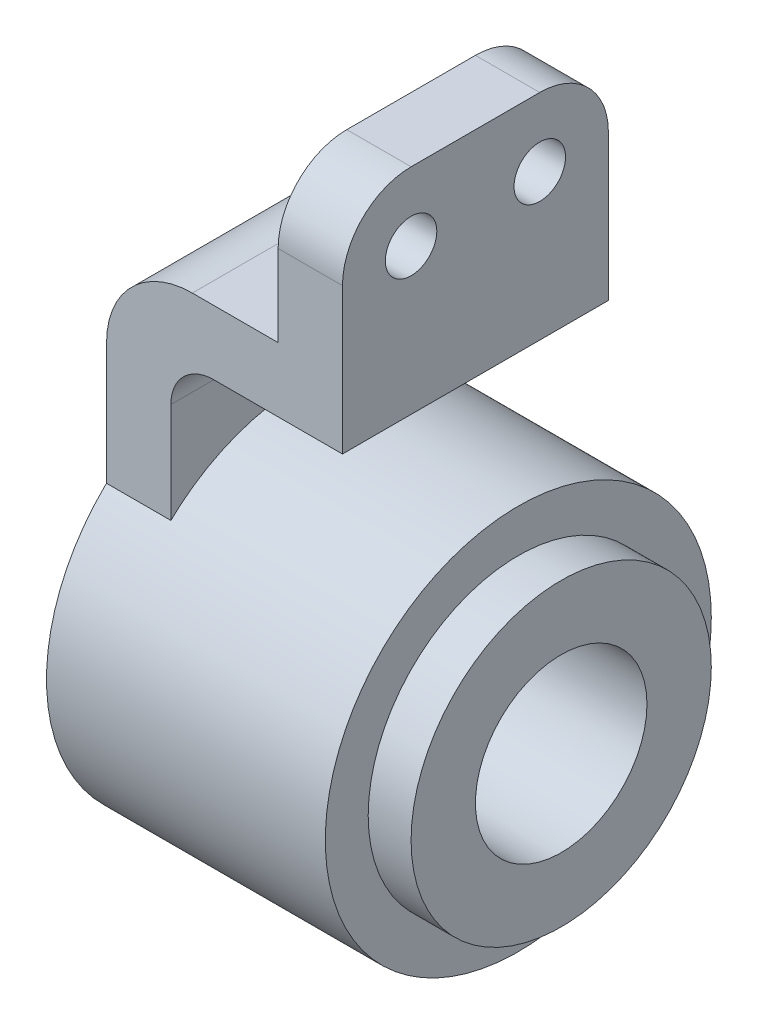
ISO-10303-21;
HEADER;
FILE_DESCRIPTION(('STEP AP214'),'2;1');
FILE_NAME('part.step','',(''),(''),'','','');
FILE_SCHEMA(('AUTOMOTIVE_DESIGN { 1 0 10303 214 1 1 1 1 }'));
ENDSEC;
DATA;
#1=APPLICATION_CONTEXT('core data for automotive mechanical design processes');
#2=APPLICATION_PROTOCOL_DEFINITION('international standard','automotive_design',2000,#1);
#3=PRODUCT_CONTEXT('',#1,'mechanical');
#4=PRODUCT('Part','Part','',(#3));
#5=PRODUCT_RELATED_PRODUCT_CATEGORY('part','',(#4));
#6=PRODUCT_DEFINITION_FORMATION('','',#4);
#7=PRODUCT_DEFINITION_CONTEXT('part definition',#1,'design');
#8=PRODUCT_DEFINITION('design','',#6,#7);
#9=PRODUCT_DEFINITION_SHAPE('','',#8);
#10=(LENGTH_UNIT() NAMED_UNIT(*) SI_UNIT(.MILLI.,.METRE.));
#11=(NAMED_UNIT(*) PLANE_ANGLE_UNIT() SI_UNIT($,.RADIAN.));
#12=(NAMED_UNIT(*) SI_UNIT($,.STERADIAN.) SOLID_ANGLE_UNIT());
#13=UNCERTAINTY_MEASURE_WITH_UNIT(LENGTH_MEASURE(1.E-05),#10,'distance_accuracy_value','');
#14=(GEOMETRIC_REPRESENTATION_CONTEXT(3) GLOBAL_UNCERTAINTY_ASSIGNED_CONTEXT((#13)) GLOBAL_UNIT_ASSIGNED_CONTEXT((#10,
#11,#12)) REPRESENTATION_CONTEXT('',''));
#15=CARTESIAN_POINT('',(0.,0.,0.));
#16=DIRECTION('',(0.,0.,1.));
#17=DIRECTION('',(1.,0.,0.));
#18=AXIS2_PLACEMENT_3D('',#15,#16,#17);
#19=CARTESIAN_POINT('',(15.,0.,31.));
#20=DIRECTION('',(0.,1.,0.));
#21=DIRECTION('',(0.,0.,1.));
#22=AXIS2_PLACEMENT_3D('',#19,#20,#21);
#23=PLANE('',#22);
#24=DIRECTION('',(0.,0.,-1.));
#25=VECTOR('',#24,1.);
#26=CARTESIAN_POINT('',(15.,0.,31.));
#27=LINE('',#26,#25);
#28=CARTESIAN_POINT('',(15.,0.,-20.));
#29=VERTEX_POINT('',#28);
#30=CARTESIAN_POINT('',(15.,0.,-31.));
#31=VERTEX_POINT('',#30);
#32=EDGE_CURVE('E203',#29,#31,#27,.T.);
#33=ORIENTED_EDGE('',*,*,#32,.F.);
#34=DIRECTION('',(-1.,0.,0.));
#35=VECTOR('',#34,1.);
#36=CARTESIAN_POINT('',(0.,0.,-20.));
#37=LINE('',#36,#35);
#38=CARTESIAN_POINT('',(0.,0.,-20.));
#39=VERTEX_POINT('',#38);
#40=EDGE_CURVE('E169',#29,#39,#37,.T.);
#41=ORIENTED_EDGE('',*,*,#40,.T.);
#42=DIRECTION('',(0.,0.,-1.));
#43=VECTOR('',#42,1.);
#44=CARTESIAN_POINT('',(0.,0.,31.));
#45=LINE('',#44,#43);
#46=CARTESIAN_POINT('',(0.,0.,-31.));
#47=VERTEX_POINT('',#46);
#48=EDGE_CURVE('E179',#39,#47,#45,.T.);
#49=ORIENTED_EDGE('',*,*,#48,.T.);
#50=DIRECTION('',(1.,0.,0.));
#51=VECTOR('',#50,1.);
#52=CARTESIAN_POINT('',(15.,0.,-31.));
#53=LINE('',#52,#51);
#54=EDGE_CURVE('E262',#47,#31,#53,.T.);
#55=ORIENTED_EDGE('',*,*,#54,.T.);
#56=EDGE_LOOP('',(#33,#41,#49,#55));
#57=FACE_BOUND('',#56,.T.);
#58=ADVANCED_FACE('F53',(#57),#23,.F.);
#59=CARTESIAN_POINT('',(0.,0.,31.));
#60=VERTEX_POINT('',#59);
#61=CARTESIAN_POINT('',(0.,0.,20.));
#62=VERTEX_POINT('',#61);
#63=EDGE_CURVE('E176',#60,#62,#45,.T.);
#64=ORIENTED_EDGE('',*,*,#63,.T.);
#65=DIRECTION('',(-1.,0.,0.));
#66=VECTOR('',#65,1.);
#67=CARTESIAN_POINT('',(0.,0.,20.));
#68=LINE('',#67,#66);
#69=CARTESIAN_POINT('',(15.,0.,20.));
#70=VERTEX_POINT('',#69);
#71=EDGE_CURVE('E158',#62,#70,#68,.F.);
#72=ORIENTED_EDGE('',*,*,#71,.T.);
#73=CARTESIAN_POINT('',(15.,0.,31.));
#74=VERTEX_POINT('',#73);
#75=EDGE_CURVE('E204',#74,#70,#27,.T.);
#76=ORIENTED_EDGE('',*,*,#75,.F.);
#77=DIRECTION('',(1.,0.,0.));
#78=VECTOR('',#77,1.);
#79=CARTESIAN_POINT('',(15.,0.,31.));
#80=LINE('',#79,#78);
#81=EDGE_CURVE('E184',#60,#74,#80,.T.);
#82=ORIENTED_EDGE('',*,*,#81,.F.);
#83=EDGE_LOOP('',(#64,#72,#76,#82));
#84=FACE_BOUND('',#83,.T.);
#85=ADVANCED_FACE('F182',(#84),#23,.F.);
#86=CARTESIAN_POINT('',(15.,66.,31.));
#87=DIRECTION('',(-1.,0.,0.));
#88=DIRECTION('',(0.,-1.,0.));
#89=AXIS2_PLACEMENT_3D('',#86,#87,#88);
#90=PLANE('',#89);
#91=DIRECTION('',(0.,1.,0.));
#92=VECTOR('',#91,1.);
#93=CARTESIAN_POINT('',(15.,66.,-31.));
#94=LINE('',#93,#92);
#95=CARTESIAN_POINT('',(15.,56.,-31.));
#96=VERTEX_POINT('',#95);
#97=EDGE_CURVE('E259',#31,#96,#94,.T.);
#98=ORIENTED_EDGE('',*,*,#97,.T.);
#99=DIRECTION('',(0.,0.,-1.));
#100=VECTOR('',#99,1.);
#101=CARTESIAN_POINT('',(15.,56.,31.));
#102=LINE('',#101,#100);
#103=CARTESIAN_POINT('',(15.,56.,31.));
#104=VERTEX_POINT('',#103);
#105=EDGE_CURVE('E210',#96,#104,#102,.F.);
#106=ORIENTED_EDGE('',*,*,#105,.T.);
#107=DIRECTION('',(0.,1.,0.));
#108=VECTOR('',#107,1.);
#109=CARTESIAN_POINT('',(15.,66.,31.));
#110=LINE('',#109,#108);
#111=EDGE_CURVE('E275',#74,#104,#110,.T.);
#112=ORIENTED_EDGE('',*,*,#111,.F.);
#113=ORIENTED_EDGE('',*,*,#75,.T.);
#114=CARTESIAN_POINT('',(15.,0.,0.));
#115=DIRECTION('',(-1.,0.,0.));
#116=DIRECTION('',(0.,-1.,0.));
#117=AXIS2_PLACEMENT_3D('',#114,#115,#116);
#118=CIRCLE('',#117,20.);
#119=EDGE_CURVE('E164',#70,#29,#118,.T.);
#120=ORIENTED_EDGE('',*,*,#119,.T.);
#121=ORIENTED_EDGE('',*,*,#32,.T.);
#122=EDGE_LOOP('',(#98,#106,#112,#113,#120,#121));
#123=FACE_BOUND('',#122,.T.);
#124=ADVANCED_FACE('F309',(#123),#90,.F.);
#125=CARTESIAN_POINT('',(55.,66.,31.));
#126=DIRECTION('',(0.,1.,0.));
#127=DIRECTION('',(0.,0.,1.));
#128=AXIS2_PLACEMENT_3D('',#125,#126,#127);
#129=PLANE('',#128);
#130=DIRECTION('',(1.,0.,0.));
#131=VECTOR('',#130,1.);
#132=CARTESIAN_POINT('',(55.,66.,31.));
#133=LINE('',#132,#131);
#134=CARTESIAN_POINT('',(25.,66.,31.));
#135=VERTEX_POINT('',#134);
#136=CARTESIAN_POINT('',(55.,66.,31.));
#137=VERTEX_POINT('',#136);
#138=EDGE_CURVE('E273',#135,#137,#133,.T.);
#139=ORIENTED_EDGE('',*,*,#138,.F.);
#140=DIRECTION('',(0.,0.,-1.));
#141=VECTOR('',#140,1.);
#142=CARTESIAN_POINT('',(25.,66.,-31.));
#143=LINE('',#142,#141);
#144=CARTESIAN_POINT('',(25.,66.,-31.));
#145=VERTEX_POINT('',#144);
#146=EDGE_CURVE('E207',#135,#145,#143,.T.);
#147=ORIENTED_EDGE('',*,*,#146,.T.);
#148=DIRECTION('',(1.,0.,0.));
#149=VECTOR('',#148,1.);
#150=CARTESIAN_POINT('',(55.,66.,-31.));
#151=LINE('',#150,#149);
#152=CARTESIAN_POINT('',(55.,66.,-31.));
#153=VERTEX_POINT('',#152);
#154=EDGE_CURVE('E255',#145,#153,#151,.T.);
#155=ORIENTED_EDGE('',*,*,#154,.T.);
#156=DIRECTION('',(0.,0.,-1.));
#157=VECTOR('',#156,1.);
#158=CARTESIAN_POINT('',(55.,66.,31.));
#159=LINE('',#158,#157);
#160=EDGE_CURVE('E200',#137,#153,#159,.T.);
#161=ORIENTED_EDGE('',*,*,#160,.F.);
#162=EDGE_LOOP('',(#139,#147,#155,#161));
#163=FACE_BOUND('',#162,.T.);
#164=ADVANCED_FACE('F350',(#163),#129,.F.);
#165=CARTESIAN_POINT('',(55.,116.,31.));
#166=DIRECTION('',(-1.,0.,0.));
#167=DIRECTION('',(0.,-1.,0.));
#168=AXIS2_PLACEMENT_3D('',#165,#166,#167);
#169=PLANE('',#168);
#170=CARTESIAN_POINT('',(55.,100.,-15.));
#171=DIRECTION('',(1.,0.,0.));
#172=DIRECTION('',(0.,0.,-1.));
#173=AXIS2_PLACEMENT_3D('',#170,#171,#172);
#174=CIRCLE('',#173,6.00000000000001);
#175=CARTESIAN_POINT('',(55.,100.,-21.));
#176=VERTEX_POINT('',#175);
#177=EDGE_CURVE('E285',#176,#176,#174,.T.);
#178=ORIENTED_EDGE('',*,*,#177,.F.);
#179=EDGE_LOOP('',(#178));
#180=FACE_BOUND('',#179,.T.);
#181=CARTESIAN_POINT('',(55.,100.,15.));
#182=DIRECTION('',(1.,0.,0.));
#183=DIRECTION('',(0.,0.,-1.));
#184=AXIS2_PLACEMENT_3D('',#181,#182,#183);
#185=CIRCLE('',#184,6.00000000000001);
#186=CARTESIAN_POINT('',(55.,100.,8.99999999999999));
#187=VERTEX_POINT('',#186);
#188=EDGE_CURVE('E282',#187,#187,#185,.T.);
#189=ORIENTED_EDGE('',*,*,#188,.F.);
#190=EDGE_LOOP('',(#189));
#191=FACE_BOUND('',#190,.T.);
#192=DIRECTION('',(0.,1.,0.));
#193=VECTOR('',#192,1.);
#194=CARTESIAN_POINT('',(55.,116.,-31.));
#195=LINE('',#194,#193);
#196=CARTESIAN_POINT('',(55.,100.,-31.));
#197=VERTEX_POINT('',#196);
#198=EDGE_CURVE('E238',#153,#197,#195,.T.);
#199=ORIENTED_EDGE('',*,*,#198,.T.);
#200=CARTESIAN_POINT('',(55.,100.,-15.));
#201=DIRECTION('',(-1.,0.,0.));
#202=DIRECTION('',(0.,-1.,0.));
#203=AXIS2_PLACEMENT_3D('',#200,#201,#202);
#204=CIRCLE('',#203,16.);
#205=CARTESIAN_POINT('',(55.,116.,-15.));
#206=VERTEX_POINT('',#205);
#207=EDGE_CURVE('E62',#197,#206,#204,.F.);
#208=ORIENTED_EDGE('',*,*,#207,.T.);
#209=DIRECTION('',(0.,0.,-1.));
#210=VECTOR('',#209,1.);
#211=CARTESIAN_POINT('',(55.,116.,31.));
#212=LINE('',#211,#210);
#213=CARTESIAN_POINT('',(55.,116.,15.));
#214=VERTEX_POINT('',#213);
#215=EDGE_CURVE('E197',#214,#206,#212,.T.);
#216=ORIENTED_EDGE('',*,*,#215,.F.);
#217=CARTESIAN_POINT('',(55.,100.,15.));
#218=DIRECTION('',(-1.,0.,0.));
#219=DIRECTION('',(0.,-1.,0.));
#220=AXIS2_PLACEMENT_3D('',#217,#218,#219);
#221=CIRCLE('',#220,16.);
#222=CARTESIAN_POINT('',(55.,100.,31.));
#223=VERTEX_POINT('',#222);
#224=EDGE_CURVE('E69',#214,#223,#221,.F.);
#225=ORIENTED_EDGE('',*,*,#224,.T.);
#226=DIRECTION('',(0.,1.,0.));
#227=VECTOR('',#226,1.);
#228=CARTESIAN_POINT('',(55.,116.,31.));
#229=LINE('',#228,#227);
#230=EDGE_CURVE('E271',#137,#223,#229,.T.);
#231=ORIENTED_EDGE('',*,*,#230,.F.);
#232=ORIENTED_EDGE('',*,*,#160,.T.);
#233=EDGE_LOOP('',(#199,#208,#216,#225,#231,#232));
#234=FACE_BOUND('',#233,.T.);
#235=ADVANCED_FACE('F237',(#180,#191,#234),#169,.F.);
#236=CARTESIAN_POINT('',(40.,116.,31.));
#237=DIRECTION('',(0.,-1.,0.));
#238=DIRECTION('',(0.,0.,-1.));
#239=AXIS2_PLACEMENT_3D('',#236,#237,#238);
#240=PLANE('',#239);
#241=ORIENTED_EDGE('',*,*,#215,.T.);
#242=DIRECTION('',(-1.,0.,0.));
#243=VECTOR('',#242,1.);
#244=CARTESIAN_POINT('',(40.,116.,-15.));
#245=LINE('',#244,#243);
#246=CARTESIAN_POINT('',(40.,116.,-15.));
#247=VERTEX_POINT('',#246);
#248=EDGE_CURVE('E227',#206,#247,#245,.T.);
#249=ORIENTED_EDGE('',*,*,#248,.T.);
#250=DIRECTION('',(0.,0.,-1.));
#251=VECTOR('',#250,1.);
#252=CARTESIAN_POINT('',(40.,116.,31.));
#253=LINE('',#252,#251);
#254=CARTESIAN_POINT('',(40.,116.,15.));
#255=VERTEX_POINT('',#254);
#256=EDGE_CURVE('E188',#255,#247,#253,.T.);
#257=ORIENTED_EDGE('',*,*,#256,.F.);
#258=DIRECTION('',(-1.,0.,0.));
#259=VECTOR('',#258,1.);
#260=CARTESIAN_POINT('',(40.,116.,15.));
#261=LINE('',#260,#259);
#262=EDGE_CURVE('E225',#255,#214,#261,.F.);
#263=ORIENTED_EDGE('',*,*,#262,.T.);
#264=EDGE_LOOP('',(#241,#249,#257,#263));
#265=FACE_BOUND('',#264,.T.);
#266=ADVANCED_FACE('F242',(#265),#240,.F.);
#267=CARTESIAN_POINT('',(40.,81.,31.));
#268=DIRECTION('',(1.,0.,0.));
#269=DIRECTION('',(0.,0.,-1.));
#270=AXIS2_PLACEMENT_3D('',#267,#268,#269);
#271=PLANE('',#270);
#272=CARTESIAN_POINT('',(40.,100.,-15.));
#273=DIRECTION('',(1.,0.,0.));
#274=DIRECTION('',(0.,0.,-1.));
#275=AXIS2_PLACEMENT_3D('',#272,#273,#274);
#276=CIRCLE('',#275,6.00000000000001);
#277=CARTESIAN_POINT('',(40.,100.,-21.));
#278=VERTEX_POINT('',#277);
#279=EDGE_CURVE('E57',#278,#278,#276,.T.);
#280=ORIENTED_EDGE('',*,*,#279,.T.);
#281=EDGE_LOOP('',(#280));
#282=FACE_BOUND('',#281,.T.);
#283=CARTESIAN_POINT('',(40.,100.,15.));
#284=DIRECTION('',(1.,0.,0.));
#285=DIRECTION('',(0.,0.,-1.));
#286=AXIS2_PLACEMENT_3D('',#283,#284,#285);
#287=CIRCLE('',#286,6.00000000000001);
#288=CARTESIAN_POINT('',(40.,100.,8.99999999999999));
#289=VERTEX_POINT('',#288);
#290=EDGE_CURVE('E180',#289,#289,#287,.T.);
#291=ORIENTED_EDGE('',*,*,#290,.T.);
#292=EDGE_LOOP('',(#291));
#293=FACE_BOUND('',#292,.T.);
#294=ORIENTED_EDGE('',*,*,#256,.T.);
#295=CARTESIAN_POINT('',(40.,100.,-15.));
#296=DIRECTION('',(1.,0.,0.));
#297=DIRECTION('',(0.,0.,-1.));
#298=AXIS2_PLACEMENT_3D('',#295,#296,#297);
#299=CIRCLE('',#298,16.);
#300=CARTESIAN_POINT('',(40.,100.,-31.));
#301=VERTEX_POINT('',#300);
#302=EDGE_CURVE('E232',#247,#301,#299,.F.);
#303=ORIENTED_EDGE('',*,*,#302,.T.);
#304=DIRECTION('',(0.,-1.,0.));
#305=VECTOR('',#304,1.);
#306=CARTESIAN_POINT('',(40.,81.,-31.));
#307=LINE('',#306,#305);
#308=CARTESIAN_POINT('',(40.,81.,-31.));
#309=VERTEX_POINT('',#308);
#310=EDGE_CURVE('E249',#301,#309,#307,.T.);
#311=ORIENTED_EDGE('',*,*,#310,.T.);
#312=DIRECTION('',(0.,0.,-1.));
#313=VECTOR('',#312,1.);
#314=CARTESIAN_POINT('',(40.,81.,31.));
#315=LINE('',#314,#313);
#316=CARTESIAN_POINT('',(40.,81.,31.));
#317=VERTEX_POINT('',#316);
#318=EDGE_CURVE('E185',#317,#309,#315,.T.);
#319=ORIENTED_EDGE('',*,*,#318,.F.);
#320=DIRECTION('',(0.,-1.,0.));
#321=VECTOR('',#320,1.);
#322=CARTESIAN_POINT('',(40.,81.,31.));
#323=LINE('',#322,#321);
#324=CARTESIAN_POINT('',(40.,100.,31.));
#325=VERTEX_POINT('',#324);
#326=EDGE_CURVE('E269',#325,#317,#323,.T.);
#327=ORIENTED_EDGE('',*,*,#326,.F.);
#328=CARTESIAN_POINT('',(40.,100.,15.));
#329=DIRECTION('',(1.,0.,0.));
#330=DIRECTION('',(0.,0.,-1.));
#331=AXIS2_PLACEMENT_3D('',#328,#329,#330);
#332=CIRCLE('',#331,16.);
#333=EDGE_CURVE('E230',#325,#255,#332,.F.);
#334=ORIENTED_EDGE('',*,*,#333,.T.);
#335=EDGE_LOOP('',(#294,#303,#311,#319,#327,#334));
#336=FACE_BOUND('',#335,.T.);
#337=ADVANCED_FACE('F247',(#282,#293,#336),#271,.F.);
#338=CARTESIAN_POINT('',(0.,81.,31.));
#339=DIRECTION('',(0.,-1.,0.));
#340=DIRECTION('',(0.,0.,-1.));
#341=AXIS2_PLACEMENT_3D('',#338,#339,#340);
#342=PLANE('',#341);
#343=DIRECTION('',(-1.,0.,0.));
#344=VECTOR('',#343,1.);
#345=CARTESIAN_POINT('',(0.,81.,-31.));
#346=LINE('',#345,#344);
#347=CARTESIAN_POINT('',(20.,81.,-31.));
#348=VERTEX_POINT('',#347);
#349=EDGE_CURVE('E253',#309,#348,#346,.T.);
#350=ORIENTED_EDGE('',*,*,#349,.T.);
#351=DIRECTION('',(0.,0.,-1.));
#352=VECTOR('',#351,1.);
#353=CARTESIAN_POINT('',(20.,81.,31.));
#354=LINE('',#353,#352);
#355=CARTESIAN_POINT('',(20.,81.,31.));
#356=VERTEX_POINT('',#355);
#357=EDGE_CURVE('E221',#348,#356,#354,.F.);
#358=ORIENTED_EDGE('',*,*,#357,.T.);
#359=DIRECTION('',(-1.,0.,0.));
#360=VECTOR('',#359,1.);
#361=CARTESIAN_POINT('',(0.,81.,31.));
#362=LINE('',#361,#360);
#363=EDGE_CURVE('E266',#317,#356,#362,.T.);
#364=ORIENTED_EDGE('',*,*,#363,.F.);
#365=ORIENTED_EDGE('',*,*,#318,.T.);
#366=EDGE_LOOP('',(#350,#358,#364,#365));
#367=FACE_BOUND('',#366,.T.);
#368=ADVANCED_FACE('F336',(#367),#342,.F.);
#369=CARTESIAN_POINT('',(0.,0.,31.));
#370=DIRECTION('',(1.,0.,0.));
#371=DIRECTION('',(0.,0.,-1.));
#372=AXIS2_PLACEMENT_3D('',#369,#370,#371);
#373=PLANE('',#372);
#374=DIRECTION('',(0.,-1.,0.));
#375=VECTOR('',#374,1.);
#376=CARTESIAN_POINT('',(0.,0.,31.));
#377=LINE('',#376,#375);
#378=CARTESIAN_POINT('',(0.,61.,31.));
#379=VERTEX_POINT('',#378);
#380=EDGE_CURVE('E190',#379,#60,#377,.T.);
#381=ORIENTED_EDGE('',*,*,#380,.F.);
#382=DIRECTION('',(0.,0.,-1.));
#383=VECTOR('',#382,1.);
#384=CARTESIAN_POINT('',(0.,61.,31.));
#385=LINE('',#384,#383);
#386=CARTESIAN_POINT('',(0.,61.,-31.));
#387=VERTEX_POINT('',#386);
#388=EDGE_CURVE('E216',#379,#387,#385,.T.);
#389=ORIENTED_EDGE('',*,*,#388,.T.);
#390=DIRECTION('',(0.,-1.,0.));
#391=VECTOR('',#390,1.);
#392=CARTESIAN_POINT('',(0.,0.,-31.));
#393=LINE('',#392,#391);
#394=EDGE_CURVE('E192',#387,#47,#393,.T.);
#395=ORIENTED_EDGE('',*,*,#394,.T.);
#396=ORIENTED_EDGE('',*,*,#48,.F.);
#397=CARTESIAN_POINT('',(0.,0.,0.));
#398=DIRECTION('',(-1.,0.,0.));
#399=DIRECTION('',(0.,0.,1.));
#400=AXIS2_PLACEMENT_3D('',#397,#398,#399);
#401=CIRCLE('',#400,20.);
#402=EDGE_CURVE('E161',#62,#39,#401,.T.);
#403=ORIENTED_EDGE('',*,*,#402,.F.);
#404=ORIENTED_EDGE('',*,*,#63,.F.);
#405=EDGE_LOOP('',(#381,#389,#395,#396,#403,#404));
#406=FACE_BOUND('',#405,.T.);
#407=ADVANCED_FACE('F175',(#406),#373,.F.);
#408=CARTESIAN_POINT('',(0.,0.,31.));
#409=DIRECTION('',(0.,0.,-1.));
#410=DIRECTION('',(-1.,0.,0.));
#411=AXIS2_PLACEMENT_3D('',#408,#409,#410);
#412=PLANE('',#411);
#413=ORIENTED_EDGE('',*,*,#230,.T.);
#414=DIRECTION('',(-1.,0.,0.));
#415=VECTOR('',#414,1.);
#416=CARTESIAN_POINT('',(0.,100.,31.));
#417=LINE('',#416,#415);
#418=EDGE_CURVE('E12',#223,#325,#417,.T.);
#419=ORIENTED_EDGE('',*,*,#418,.T.);
#420=ORIENTED_EDGE('',*,*,#326,.T.);
#421=ORIENTED_EDGE('',*,*,#363,.T.);
#422=CARTESIAN_POINT('',(20.,61.,31.));
#423=DIRECTION('',(0.,0.,-1.));
#424=DIRECTION('',(-1.,0.,0.));
#425=AXIS2_PLACEMENT_3D('',#422,#423,#424);
#426=CIRCLE('',#425,20.);
#427=EDGE_CURVE('E223',#356,#379,#426,.F.);
#428=ORIENTED_EDGE('',*,*,#427,.T.);
#429=ORIENTED_EDGE('',*,*,#380,.T.);
#430=ORIENTED_EDGE('',*,*,#81,.T.);
#431=ORIENTED_EDGE('',*,*,#111,.T.);
#432=CARTESIAN_POINT('',(25.,56.,31.));
#433=DIRECTION('',(0.,0.,-1.));
#434=DIRECTION('',(-1.,0.,0.));
#435=AXIS2_PLACEMENT_3D('',#432,#433,#434);
#436=CIRCLE('',#435,10.);
#437=EDGE_CURVE('E214',#104,#135,#436,.T.);
#438=ORIENTED_EDGE('',*,*,#437,.T.);
#439=ORIENTED_EDGE('',*,*,#138,.T.);
#440=EDGE_LOOP('',(#413,#419,#420,#421,#428,#429,#430,#431,#438,#439));
#441=FACE_BOUND('',#440,.T.);
#442=ADVANCED_FACE('F333',(#441),#412,.F.);
#443=CARTESIAN_POINT('',(0.,0.,-31.));
#444=DIRECTION('',(0.,0.,-1.));
#445=DIRECTION('',(-1.,0.,0.));
#446=AXIS2_PLACEMENT_3D('',#443,#444,#445);
#447=PLANE('',#446);
#448=ORIENTED_EDGE('',*,*,#310,.F.);
#449=DIRECTION('',(-1.,0.,0.));
#450=VECTOR('',#449,1.);
#451=CARTESIAN_POINT('',(55.,100.,-31.));
#452=LINE('',#451,#450);
#453=EDGE_CURVE('E77',#301,#197,#452,.F.);
#454=ORIENTED_EDGE('',*,*,#453,.T.);
#455=ORIENTED_EDGE('',*,*,#198,.F.);
#456=ORIENTED_EDGE('',*,*,#154,.F.);
#457=CARTESIAN_POINT('',(25.,56.,-31.));
#458=DIRECTION('',(0.,0.,-1.));
#459=DIRECTION('',(-1.,0.,0.));
#460=AXIS2_PLACEMENT_3D('',#457,#458,#459);
#461=CIRCLE('',#460,10.);
#462=EDGE_CURVE('E212',#145,#96,#461,.F.);
#463=ORIENTED_EDGE('',*,*,#462,.T.);
#464=ORIENTED_EDGE('',*,*,#97,.F.);
#465=ORIENTED_EDGE('',*,*,#54,.F.);
#466=ORIENTED_EDGE('',*,*,#394,.F.);
#467=CARTESIAN_POINT('',(20.,61.,-31.));
#468=DIRECTION('',(0.,0.,-1.));
#469=DIRECTION('',(-1.,0.,0.));
#470=AXIS2_PLACEMENT_3D('',#467,#468,#469);
#471=CIRCLE('',#470,20.);
#472=EDGE_CURVE('E219',#387,#348,#471,.T.);
#473=ORIENTED_EDGE('',*,*,#472,.T.);
#474=ORIENTED_EDGE('',*,*,#349,.F.);
#475=EDGE_LOOP('',(#448,#454,#455,#456,#463,#464,#465,#466,#473,#474));
#476=FACE_BOUND('',#475,.T.);
#477=ADVANCED_FACE('F251',(#476),#447,.T.);
#478=CARTESIAN_POINT('',(0.,0.,0.));
#479=DIRECTION('',(-1.,0.,0.));
#480=DIRECTION('',(0.,0.,1.));
#481=AXIS2_PLACEMENT_3D('',#478,#479,#480);
#482=CYLINDRICAL_SURFACE('',#481,20.);
#483=ORIENTED_EDGE('',*,*,#119,.F.);
#484=ORIENTED_EDGE('',*,*,#71,.F.);
#485=ORIENTED_EDGE('',*,*,#402,.T.);
#486=ORIENTED_EDGE('',*,*,#40,.F.);
#487=EDGE_LOOP('',(#483,#484,#485,#486));
#488=FACE_BOUND('',#487,.T.);
#489=ADVANCED_FACE('F160',(#488),#482,.F.);
#490=CARTESIAN_POINT('',(25.,56.,31.));
#491=DIRECTION('',(0.,0.,1.));
#492=DIRECTION('',(1.,0.,0.));
#493=AXIS2_PLACEMENT_3D('',#490,#491,#492);
#494=CYLINDRICAL_SURFACE('',#493,10.);
#495=ORIENTED_EDGE('',*,*,#437,.F.);
#496=ORIENTED_EDGE('',*,*,#105,.F.);
#497=ORIENTED_EDGE('',*,*,#462,.F.);
#498=ORIENTED_EDGE('',*,*,#146,.F.);
#499=EDGE_LOOP('',(#495,#496,#497,#498));
#500=FACE_BOUND('',#499,.T.);
#501=ADVANCED_FACE('F314',(#500),#494,.F.);
#502=CARTESIAN_POINT('',(20.,61.,31.));
#503=DIRECTION('',(0.,0.,-1.));
#504=DIRECTION('',(-1.,0.,0.));
#505=AXIS2_PLACEMENT_3D('',#502,#503,#504);
#506=CYLINDRICAL_SURFACE('',#505,20.);
#507=ORIENTED_EDGE('',*,*,#427,.F.);
#508=ORIENTED_EDGE('',*,*,#357,.F.);
#509=ORIENTED_EDGE('',*,*,#472,.F.);
#510=ORIENTED_EDGE('',*,*,#388,.F.);
#511=EDGE_LOOP('',(#507,#508,#509,#510));
#512=FACE_BOUND('',#511,.T.);
#513=ADVANCED_FACE('F317',(#512),#506,.T.);
#514=CARTESIAN_POINT('',(40.,100.,-15.));
#515=DIRECTION('',(1.,0.,0.));
#516=DIRECTION('',(0.,0.,-1.));
#517=AXIS2_PLACEMENT_3D('',#514,#515,#516);
#518=CYLINDRICAL_SURFACE('',#517,16.);
#519=ORIENTED_EDGE('',*,*,#207,.F.);
#520=ORIENTED_EDGE('',*,*,#453,.F.);
#521=ORIENTED_EDGE('',*,*,#302,.F.);
#522=ORIENTED_EDGE('',*,*,#248,.F.);
#523=EDGE_LOOP('',(#519,#520,#521,#522));
#524=FACE_BOUND('',#523,.T.);
#525=ADVANCED_FACE('F245',(#524),#518,.T.);
#526=CARTESIAN_POINT('',(0.,100.,15.));
#527=DIRECTION('',(-1.,0.,0.));
#528=DIRECTION('',(0.,0.,1.));
#529=AXIS2_PLACEMENT_3D('',#526,#527,#528);
#530=CYLINDRICAL_SURFACE('',#529,16.);
#531=ORIENTED_EDGE('',*,*,#224,.F.);
#532=ORIENTED_EDGE('',*,*,#262,.F.);
#533=ORIENTED_EDGE('',*,*,#333,.F.);
#534=ORIENTED_EDGE('',*,*,#418,.F.);
#535=EDGE_LOOP('',(#531,#532,#533,#534));
#536=FACE_BOUND('',#535,.T.);
#537=ADVANCED_FACE('F55',(#536),#530,.T.);
#538=CARTESIAN_POINT('',(55.,100.,15.));
#539=DIRECTION('',(1.,0.,0.));
#540=DIRECTION('',(0.,0.,-1.));
#541=AXIS2_PLACEMENT_3D('',#538,#539,#540);
#542=CYLINDRICAL_SURFACE('',#541,6.00000000000001);
#543=ORIENTED_EDGE('',*,*,#188,.T.);
#544=EDGE_LOOP('',(#543));
#545=FACE_BOUND('',#544,.T.);
#546=ORIENTED_EDGE('',*,*,#290,.F.);
#547=EDGE_LOOP('',(#546));
#548=FACE_BOUND('',#547,.T.);
#549=ADVANCED_FACE('F296',(#545,#548),#542,.F.);
#550=CARTESIAN_POINT('',(55.,100.,-15.));
#551=DIRECTION('',(1.,0.,0.));
#552=DIRECTION('',(0.,0.,-1.));
#553=AXIS2_PLACEMENT_3D('',#550,#551,#552);
#554=CYLINDRICAL_SURFACE('',#553,6.00000000000001);
#555=ORIENTED_EDGE('',*,*,#177,.T.);
#556=EDGE_LOOP('',(#555));
#557=FACE_BOUND('',#556,.T.);
#558=ORIENTED_EDGE('',*,*,#279,.F.);
#559=EDGE_LOOP('',(#558));
#560=FACE_BOUND('',#559,.T.);
#561=ADVANCED_FACE('F294',(#557,#560),#554,.F.);
#562=CLOSED_SHELL('',(#58,#85,#124,#164,#235,#266,#337,#368,#407,#442,#477,#489,#501,#513,#525,
#537,#549,#561));
#563=MANIFOLD_SOLID_BREP('B2',#562);
#564=CARTESIAN_POINT('',(0.,0.,0.));
#565=DIRECTION('',(-1.,0.,0.));
#566=DIRECTION('',(0.,0.,1.));
#567=AXIS2_PLACEMENT_3D('',#564,#565,#566);
#568=PLANE('',#567);
#569=CARTESIAN_POINT('',(0.,0.,0.));
#570=DIRECTION('',(1.,0.,0.));
#571=DIRECTION('',(0.,0.,-1.));
#572=AXIS2_PLACEMENT_3D('',#569,#570,#571);
#573=CIRCLE('',#572,20.);
#574=CARTESIAN_POINT('',(0.,0.,-20.));
#575=VERTEX_POINT('',#574);
#576=EDGE_CURVE('E495',#575,#575,#573,.T.);
#577=ORIENTED_EDGE('',*,*,#576,.T.);
#578=EDGE_LOOP('',(#577));
#579=FACE_BOUND('',#578,.T.);
#580=CARTESIAN_POINT('',(0.,0.,0.));
#581=DIRECTION('',(1.,0.,0.));
#582=DIRECTION('',(0.,0.,-1.));
#583=AXIS2_PLACEMENT_3D('',#580,#581,#582);
#584=CIRCLE('',#583,45.);
#585=CARTESIAN_POINT('',(0.,0.,-45.));
#586=VERTEX_POINT('',#585);
#587=EDGE_CURVE('E52',#586,#586,#584,.T.);
#588=ORIENTED_EDGE('',*,*,#587,.F.);
#589=EDGE_LOOP('',(#588));
#590=FACE_BOUND('',#589,.T.);
#591=ADVANCED_FACE('F476',(#579,#590),#568,.T.);
#592=CARTESIAN_POINT('',(75.,0.,0.));
#593=DIRECTION('',(1.,0.,0.));
#594=DIRECTION('',(0.,0.,-1.));
#595=AXIS2_PLACEMENT_3D('',#592,#593,#594);
#596=CYLINDRICAL_SURFACE('',#595,45.);
#597=ORIENTED_EDGE('',*,*,#587,.T.);
#598=EDGE_LOOP('',(#597));
#599=FACE_BOUND('',#598,.T.);
#600=CARTESIAN_POINT('',(65.,0.,0.));
#601=DIRECTION('',(1.,0.,0.));
#602=DIRECTION('',(0.,0.,-1.));
#603=AXIS2_PLACEMENT_3D('',#600,#601,#602);
#604=CIRCLE('',#603,45.);
#605=CARTESIAN_POINT('',(65.,0.,-45.));
#606=VERTEX_POINT('',#605);
#607=EDGE_CURVE('E482',#606,#606,#604,.T.);
#608=ORIENTED_EDGE('',*,*,#607,.F.);
#609=EDGE_LOOP('',(#608));
#610=FACE_BOUND('',#609,.T.);
#611=ADVANCED_FACE('F519',(#599,#610),#596,.T.);
#612=CARTESIAN_POINT('',(65.,45.,0.));
#613=DIRECTION('',(1.,0.,0.));
#614=DIRECTION('',(0.,0.,-1.));
#615=AXIS2_PLACEMENT_3D('',#612,#613,#614);
#616=PLANE('',#615);
#617=ORIENTED_EDGE('',*,*,#607,.T.);
#618=EDGE_LOOP('',(#617));
#619=FACE_BOUND('',#618,.T.);
#620=CARTESIAN_POINT('',(65.,0.,0.));
#621=DIRECTION('',(1.,0.,0.));
#622=DIRECTION('',(0.,0.,-1.));
#623=AXIS2_PLACEMENT_3D('',#620,#621,#622);
#624=CIRCLE('',#623,35.);
#625=CARTESIAN_POINT('',(65.,0.,-35.));
#626=VERTEX_POINT('',#625);
#627=EDGE_CURVE('E486',#626,#626,#624,.T.);
#628=ORIENTED_EDGE('',*,*,#627,.F.);
#629=EDGE_LOOP('',(#628));
#630=FACE_BOUND('',#629,.T.);
#631=ADVANCED_FACE('F512',(#619,#630),#616,.T.);
#632=CARTESIAN_POINT('',(75.,0.,0.));
#633=DIRECTION('',(1.,0.,0.));
#634=DIRECTION('',(0.,0.,-1.));
#635=AXIS2_PLACEMENT_3D('',#632,#633,#634);
#636=CYLINDRICAL_SURFACE('',#635,35.);
#637=ORIENTED_EDGE('',*,*,#627,.T.);
#638=EDGE_LOOP('',(#637));
#639=FACE_BOUND('',#638,.T.);
#640=CARTESIAN_POINT('',(75.,0.,0.));
#641=DIRECTION('',(1.,0.,0.));
#642=DIRECTION('',(0.,0.,-1.));
#643=AXIS2_PLACEMENT_3D('',#640,#641,#642);
#644=CIRCLE('',#643,35.);
#645=CARTESIAN_POINT('',(75.,0.,-35.));
#646=VERTEX_POINT('',#645);
#647=EDGE_CURVE('E490',#646,#646,#644,.T.);
#648=ORIENTED_EDGE('',*,*,#647,.F.);
#649=EDGE_LOOP('',(#648));
#650=FACE_BOUND('',#649,.T.);
#651=ADVANCED_FACE('F507',(#639,#650),#636,.T.);
#652=CARTESIAN_POINT('',(75.,35.,0.));
#653=DIRECTION('',(1.,0.,0.));
#654=DIRECTION('',(0.,0.,-1.));
#655=AXIS2_PLACEMENT_3D('',#652,#653,#654);
#656=PLANE('',#655);
#657=CARTESIAN_POINT('',(75.,0.,0.));
#658=DIRECTION('',(1.,0.,0.));
#659=DIRECTION('',(0.,0.,-1.));
#660=AXIS2_PLACEMENT_3D('',#657,#658,#659);
#661=CIRCLE('',#660,20.);
#662=CARTESIAN_POINT('',(75.,0.,-20.));
#663=VERTEX_POINT('',#662);
#664=EDGE_CURVE('E498',#663,#663,#661,.T.);
#665=ORIENTED_EDGE('',*,*,#664,.F.);
#666=EDGE_LOOP('',(#665));
#667=FACE_BOUND('',#666,.T.);
#668=ORIENTED_EDGE('',*,*,#647,.T.);
#669=EDGE_LOOP('',(#668));
#670=FACE_BOUND('',#669,.T.);
#671=ADVANCED_FACE('F504',(#667,#670),#656,.T.);
#672=CARTESIAN_POINT('',(75.,0.,0.));
#673=DIRECTION('',(1.,0.,0.));
#674=DIRECTION('',(0.,0.,-1.));
#675=AXIS2_PLACEMENT_3D('',#672,#673,#674);
#676=CYLINDRICAL_SURFACE('',#675,20.);
#677=ORIENTED_EDGE('',*,*,#576,.F.);
#678=EDGE_LOOP('',(#677));
#679=FACE_BOUND('',#678,.T.);
#680=ORIENTED_EDGE('',*,*,#664,.T.);
#681=EDGE_LOOP('',(#680));
#682=FACE_BOUND('',#681,.T.);
#683=ADVANCED_FACE('F502',(#679,#682),#676,.F.);
#684=CLOSED_SHELL('',(#591,#611,#631,#651,#671,#683));
#685=MANIFOLD_SOLID_BREP('B6',#684);
#686=ADVANCED_BREP_SHAPE_REPRESENTATION('',(#18,#563,#685),#14);
#687=SHAPE_DEFINITION_REPRESENTATION(#9,#686);
ENDSEC;
END-ISO-10303-21;
